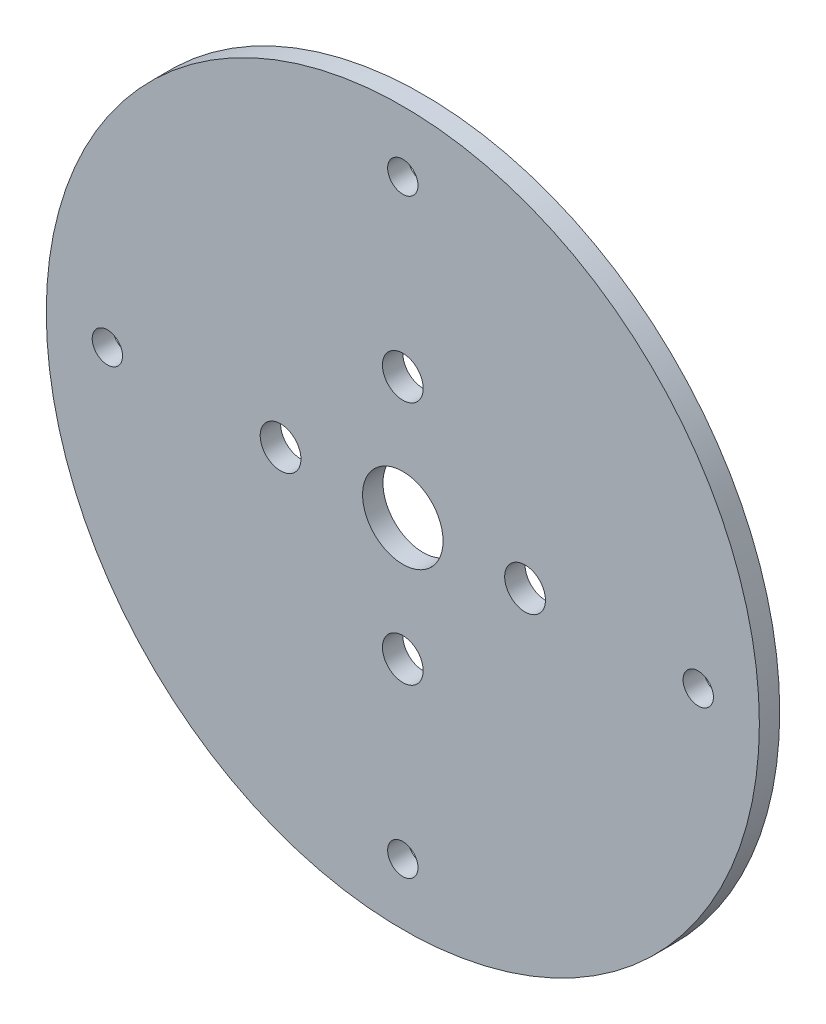
ISO-10303-21;
HEADER;
FILE_DESCRIPTION(('STEP AP214'),'2;1');
FILE_NAME('part.step','',(''),(''),'','','');
FILE_SCHEMA(('AUTOMOTIVE_DESIGN { 1 0 10303 214 1 1 1 1 }'));
ENDSEC;
DATA;
#1=APPLICATION_CONTEXT('core data for automotive mechanical design processes');
#2=APPLICATION_PROTOCOL_DEFINITION('international standard','automotive_design',2000,#1);
#3=PRODUCT_CONTEXT('',#1,'mechanical');
#4=PRODUCT('Part','Part','',(#3));
#5=PRODUCT_RELATED_PRODUCT_CATEGORY('part','',(#4));
#6=PRODUCT_DEFINITION_FORMATION('','',#4);
#7=PRODUCT_DEFINITION_CONTEXT('part definition',#1,'design');
#8=PRODUCT_DEFINITION('design','',#6,#7);
#9=PRODUCT_DEFINITION_SHAPE('','',#8);
#10=(LENGTH_UNIT() NAMED_UNIT(*) SI_UNIT(.MILLI.,.METRE.));
#11=(NAMED_UNIT(*) PLANE_ANGLE_UNIT() SI_UNIT($,.RADIAN.));
#12=(NAMED_UNIT(*) SI_UNIT($,.STERADIAN.) SOLID_ANGLE_UNIT());
#13=UNCERTAINTY_MEASURE_WITH_UNIT(LENGTH_MEASURE(1.E-05),#10,'distance_accuracy_value','');
#14=(GEOMETRIC_REPRESENTATION_CONTEXT(3) GLOBAL_UNCERTAINTY_ASSIGNED_CONTEXT((#13)) GLOBAL_UNIT_ASSIGNED_CONTEXT((#10,
#11,#12)) REPRESENTATION_CONTEXT('',''));
#15=CARTESIAN_POINT('',(0.,0.,0.));
#16=DIRECTION('',(0.,0.,1.));
#17=DIRECTION('',(1.,0.,0.));
#18=AXIS2_PLACEMENT_3D('',#15,#16,#17);
#19=CARTESIAN_POINT('',(0.,0.,2.));
#20=DIRECTION('',(0.,0.,1.));
#21=DIRECTION('',(1.,0.,0.));
#22=AXIS2_PLACEMENT_3D('',#19,#20,#21);
#23=PLANE('',#22);
#24=CARTESIAN_POINT('',(0.,-12.,2.));
#25=DIRECTION('',(0.,0.,1.));
#26=DIRECTION('',(1.,0.,0.));
#27=AXIS2_PLACEMENT_3D('',#24,#25,#26);
#28=CIRCLE('',#27,2.);
#29=CARTESIAN_POINT('',(2.,-12.,2.));
#30=VERTEX_POINT('',#29);
#31=EDGE_CURVE('E83',#30,#30,#28,.T.);
#32=ORIENTED_EDGE('',*,*,#31,.F.);
#33=EDGE_LOOP('',(#32));
#34=FACE_BOUND('',#33,.T.);
#35=CARTESIAN_POINT('',(0.,12.,2.));
#36=DIRECTION('',(0.,0.,1.));
#37=DIRECTION('',(1.,0.,0.));
#38=AXIS2_PLACEMENT_3D('',#35,#36,#37);
#39=CIRCLE('',#38,2.);
#40=CARTESIAN_POINT('',(2.,12.,2.));
#41=VERTEX_POINT('',#40);
#42=EDGE_CURVE('E71',#41,#41,#39,.T.);
#43=ORIENTED_EDGE('',*,*,#42,.F.);
#44=EDGE_LOOP('',(#43));
#45=FACE_BOUND('',#44,.T.);
#46=CARTESIAN_POINT('',(0.,29.,2.));
#47=DIRECTION('',(0.,0.,1.));
#48=DIRECTION('',(1.,0.,0.));
#49=AXIS2_PLACEMENT_3D('',#46,#47,#48);
#50=CIRCLE('',#49,1.49);
#51=CARTESIAN_POINT('',(1.49,29.,2.));
#52=VERTEX_POINT('',#51);
#53=EDGE_CURVE('E59',#52,#52,#50,.T.);
#54=ORIENTED_EDGE('',*,*,#53,.F.);
#55=EDGE_LOOP('',(#54));
#56=FACE_BOUND('',#55,.T.);
#57=CARTESIAN_POINT('',(0.,0.,2.));
#58=DIRECTION('',(0.,0.,1.));
#59=DIRECTION('',(1.,0.,0.));
#60=AXIS2_PLACEMENT_3D('',#57,#58,#59);
#61=CIRCLE('',#60,3.95);
#62=CARTESIAN_POINT('',(3.95,0.,2.));
#63=VERTEX_POINT('',#62);
#64=EDGE_CURVE('E47',#63,#63,#61,.T.);
#65=ORIENTED_EDGE('',*,*,#64,.F.);
#66=EDGE_LOOP('',(#65));
#67=FACE_BOUND('',#66,.T.);
#68=CARTESIAN_POINT('',(0.,0.,2.));
#69=DIRECTION('',(0.,0.,1.));
#70=DIRECTION('',(1.,0.,0.));
#71=AXIS2_PLACEMENT_3D('',#68,#69,#70);
#72=CIRCLE('',#71,35.);
#73=CARTESIAN_POINT('',(35.,0.,2.));
#74=VERTEX_POINT('',#73);
#75=EDGE_CURVE('E10',#74,#74,#72,.T.);
#76=ORIENTED_EDGE('',*,*,#75,.T.);
#77=EDGE_LOOP('',(#76));
#78=FACE_BOUND('',#77,.T.);
#79=CARTESIAN_POINT('',(-29.,0.,2.));
#80=DIRECTION('',(0.,0.,1.));
#81=DIRECTION('',(1.,0.,0.));
#82=AXIS2_PLACEMENT_3D('',#79,#80,#81);
#83=CIRCLE('',#82,1.49);
#84=CARTESIAN_POINT('',(-27.51,0.,2.));
#85=VERTEX_POINT('',#84);
#86=EDGE_CURVE('E42',#85,#85,#83,.T.);
#87=ORIENTED_EDGE('',*,*,#86,.F.);
#88=EDGE_LOOP('',(#87));
#89=FACE_BOUND('',#88,.T.);
#90=CARTESIAN_POINT('',(29.,0.,2.));
#91=DIRECTION('',(0.,0.,1.));
#92=DIRECTION('',(1.,0.,0.));
#93=AXIS2_PLACEMENT_3D('',#90,#91,#92);
#94=CIRCLE('',#93,1.49);
#95=CARTESIAN_POINT('',(30.49,0.,2.));
#96=VERTEX_POINT('',#95);
#97=EDGE_CURVE('E53',#96,#96,#94,.T.);
#98=ORIENTED_EDGE('',*,*,#97,.F.);
#99=EDGE_LOOP('',(#98));
#100=FACE_BOUND('',#99,.T.);
#101=CARTESIAN_POINT('',(0.,-29.,2.));
#102=DIRECTION('',(0.,0.,1.));
#103=DIRECTION('',(1.,0.,0.));
#104=AXIS2_PLACEMENT_3D('',#101,#102,#103);
#105=CIRCLE('',#104,1.49);
#106=CARTESIAN_POINT('',(1.49,-29.,2.));
#107=VERTEX_POINT('',#106);
#108=EDGE_CURVE('E65',#107,#107,#105,.T.);
#109=ORIENTED_EDGE('',*,*,#108,.F.);
#110=EDGE_LOOP('',(#109));
#111=FACE_BOUND('',#110,.T.);
#112=CARTESIAN_POINT('',(12.,0.,2.));
#113=DIRECTION('',(0.,0.,1.));
#114=DIRECTION('',(1.,0.,0.));
#115=AXIS2_PLACEMENT_3D('',#112,#113,#114);
#116=CIRCLE('',#115,2.);
#117=CARTESIAN_POINT('',(14.,0.,2.));
#118=VERTEX_POINT('',#117);
#119=EDGE_CURVE('E77',#118,#118,#116,.T.);
#120=ORIENTED_EDGE('',*,*,#119,.F.);
#121=EDGE_LOOP('',(#120));
#122=FACE_BOUND('',#121,.T.);
#123=CARTESIAN_POINT('',(-12.,0.,2.));
#124=DIRECTION('',(0.,0.,1.));
#125=DIRECTION('',(1.,0.,0.));
#126=AXIS2_PLACEMENT_3D('',#123,#124,#125);
#127=CIRCLE('',#126,2.);
#128=CARTESIAN_POINT('',(-10.,0.,2.));
#129=VERTEX_POINT('',#128);
#130=EDGE_CURVE('E89',#129,#129,#127,.T.);
#131=ORIENTED_EDGE('',*,*,#130,.F.);
#132=EDGE_LOOP('',(#131));
#133=FACE_BOUND('',#132,.T.);
#134=ADVANCED_FACE('F31',(#34,#45,#56,#67,#78,#89,#100,#111,#122,#133),#23,.T.);
#135=CARTESIAN_POINT('',(0.,0.,0.));
#136=DIRECTION('',(0.,0.,1.));
#137=DIRECTION('',(1.,0.,0.));
#138=AXIS2_PLACEMENT_3D('',#135,#136,#137);
#139=PLANE('',#138);
#140=CARTESIAN_POINT('',(0.,0.,0.));
#141=DIRECTION('',(0.,0.,1.));
#142=DIRECTION('',(1.,0.,0.));
#143=AXIS2_PLACEMENT_3D('',#140,#141,#142);
#144=CIRCLE('',#143,35.);
#145=CARTESIAN_POINT('',(35.,0.,0.));
#146=VERTEX_POINT('',#145);
#147=EDGE_CURVE('E35',#146,#146,#144,.T.);
#148=ORIENTED_EDGE('',*,*,#147,.F.);
#149=EDGE_LOOP('',(#148));
#150=FACE_BOUND('',#149,.T.);
#151=CARTESIAN_POINT('',(-29.,0.,0.));
#152=DIRECTION('',(0.,0.,1.));
#153=DIRECTION('',(1.,0.,0.));
#154=AXIS2_PLACEMENT_3D('',#151,#152,#153);
#155=CIRCLE('',#154,1.49);
#156=CARTESIAN_POINT('',(-27.51,0.,0.));
#157=VERTEX_POINT('',#156);
#158=EDGE_CURVE('E44',#157,#157,#155,.T.);
#159=ORIENTED_EDGE('',*,*,#158,.T.);
#160=EDGE_LOOP('',(#159));
#161=FACE_BOUND('',#160,.T.);
#162=CARTESIAN_POINT('',(0.,0.,0.));
#163=DIRECTION('',(0.,0.,1.));
#164=DIRECTION('',(1.,0.,0.));
#165=AXIS2_PLACEMENT_3D('',#162,#163,#164);
#166=CIRCLE('',#165,3.95);
#167=CARTESIAN_POINT('',(3.95,0.,0.));
#168=VERTEX_POINT('',#167);
#169=EDGE_CURVE('E50',#168,#168,#166,.T.);
#170=ORIENTED_EDGE('',*,*,#169,.T.);
#171=EDGE_LOOP('',(#170));
#172=FACE_BOUND('',#171,.T.);
#173=CARTESIAN_POINT('',(29.,0.,0.));
#174=DIRECTION('',(0.,0.,1.));
#175=DIRECTION('',(1.,0.,0.));
#176=AXIS2_PLACEMENT_3D('',#173,#174,#175);
#177=CIRCLE('',#176,1.49);
#178=CARTESIAN_POINT('',(30.49,0.,0.));
#179=VERTEX_POINT('',#178);
#180=EDGE_CURVE('E56',#179,#179,#177,.T.);
#181=ORIENTED_EDGE('',*,*,#180,.T.);
#182=EDGE_LOOP('',(#181));
#183=FACE_BOUND('',#182,.T.);
#184=CARTESIAN_POINT('',(0.,29.,0.));
#185=DIRECTION('',(0.,0.,1.));
#186=DIRECTION('',(1.,0.,0.));
#187=AXIS2_PLACEMENT_3D('',#184,#185,#186);
#188=CIRCLE('',#187,1.49);
#189=CARTESIAN_POINT('',(1.49,29.,0.));
#190=VERTEX_POINT('',#189);
#191=EDGE_CURVE('E62',#190,#190,#188,.T.);
#192=ORIENTED_EDGE('',*,*,#191,.T.);
#193=EDGE_LOOP('',(#192));
#194=FACE_BOUND('',#193,.T.);
#195=CARTESIAN_POINT('',(0.,-29.,0.));
#196=DIRECTION('',(0.,0.,1.));
#197=DIRECTION('',(1.,0.,0.));
#198=AXIS2_PLACEMENT_3D('',#195,#196,#197);
#199=CIRCLE('',#198,1.49);
#200=CARTESIAN_POINT('',(1.49,-29.,0.));
#201=VERTEX_POINT('',#200);
#202=EDGE_CURVE('E68',#201,#201,#199,.T.);
#203=ORIENTED_EDGE('',*,*,#202,.T.);
#204=EDGE_LOOP('',(#203));
#205=FACE_BOUND('',#204,.T.);
#206=CARTESIAN_POINT('',(0.,12.,0.));
#207=DIRECTION('',(0.,0.,1.));
#208=DIRECTION('',(1.,0.,0.));
#209=AXIS2_PLACEMENT_3D('',#206,#207,#208);
#210=CIRCLE('',#209,2.);
#211=CARTESIAN_POINT('',(2.,12.,0.));
#212=VERTEX_POINT('',#211);
#213=EDGE_CURVE('E74',#212,#212,#210,.T.);
#214=ORIENTED_EDGE('',*,*,#213,.T.);
#215=EDGE_LOOP('',(#214));
#216=FACE_BOUND('',#215,.T.);
#217=CARTESIAN_POINT('',(12.,0.,0.));
#218=DIRECTION('',(0.,0.,1.));
#219=DIRECTION('',(1.,0.,0.));
#220=AXIS2_PLACEMENT_3D('',#217,#218,#219);
#221=CIRCLE('',#220,2.);
#222=CARTESIAN_POINT('',(14.,0.,0.));
#223=VERTEX_POINT('',#222);
#224=EDGE_CURVE('E80',#223,#223,#221,.T.);
#225=ORIENTED_EDGE('',*,*,#224,.T.);
#226=EDGE_LOOP('',(#225));
#227=FACE_BOUND('',#226,.T.);
#228=CARTESIAN_POINT('',(0.,-12.,0.));
#229=DIRECTION('',(0.,0.,1.));
#230=DIRECTION('',(1.,0.,0.));
#231=AXIS2_PLACEMENT_3D('',#228,#229,#230);
#232=CIRCLE('',#231,2.);
#233=CARTESIAN_POINT('',(2.,-12.,0.));
#234=VERTEX_POINT('',#233);
#235=EDGE_CURVE('E86',#234,#234,#232,.T.);
#236=ORIENTED_EDGE('',*,*,#235,.T.);
#237=EDGE_LOOP('',(#236));
#238=FACE_BOUND('',#237,.T.);
#239=CARTESIAN_POINT('',(-12.,0.,0.));
#240=DIRECTION('',(0.,0.,1.));
#241=DIRECTION('',(1.,0.,0.));
#242=AXIS2_PLACEMENT_3D('',#239,#240,#241);
#243=CIRCLE('',#242,2.);
#244=CARTESIAN_POINT('',(-10.,0.,0.));
#245=VERTEX_POINT('',#244);
#246=EDGE_CURVE('E92',#245,#245,#243,.T.);
#247=ORIENTED_EDGE('',*,*,#246,.T.);
#248=EDGE_LOOP('',(#247));
#249=FACE_BOUND('',#248,.T.);
#250=ADVANCED_FACE('F102',(#150,#161,#172,#183,#194,#205,#216,#227,#238,#249),#139,.F.);
#251=CARTESIAN_POINT('',(0.,0.,2.));
#252=DIRECTION('',(0.,0.,-1.));
#253=DIRECTION('',(-1.,0.,0.));
#254=AXIS2_PLACEMENT_3D('',#251,#252,#253);
#255=CYLINDRICAL_SURFACE('',#254,35.);
#256=ORIENTED_EDGE('',*,*,#75,.F.);
#257=EDGE_LOOP('',(#256));
#258=FACE_BOUND('',#257,.T.);
#259=ORIENTED_EDGE('',*,*,#147,.T.);
#260=EDGE_LOOP('',(#259));
#261=FACE_BOUND('',#260,.T.);
#262=ADVANCED_FACE('F33',(#258,#261),#255,.T.);
#263=CARTESIAN_POINT('',(-29.,0.,2.));
#264=DIRECTION('',(0.,0.,-1.));
#265=DIRECTION('',(-1.,0.,0.));
#266=AXIS2_PLACEMENT_3D('',#263,#264,#265);
#267=CYLINDRICAL_SURFACE('',#266,1.49);
#268=ORIENTED_EDGE('',*,*,#86,.T.);
#269=EDGE_LOOP('',(#268));
#270=FACE_BOUND('',#269,.T.);
#271=ORIENTED_EDGE('',*,*,#158,.F.);
#272=EDGE_LOOP('',(#271));
#273=FACE_BOUND('',#272,.T.);
#274=ADVANCED_FACE('F112',(#270,#273),#267,.F.);
#275=CARTESIAN_POINT('',(0.,0.,2.));
#276=DIRECTION('',(0.,0.,-1.));
#277=DIRECTION('',(-1.,0.,0.));
#278=AXIS2_PLACEMENT_3D('',#275,#276,#277);
#279=CYLINDRICAL_SURFACE('',#278,3.95);
#280=ORIENTED_EDGE('',*,*,#64,.T.);
#281=EDGE_LOOP('',(#280));
#282=FACE_BOUND('',#281,.T.);
#283=ORIENTED_EDGE('',*,*,#169,.F.);
#284=EDGE_LOOP('',(#283));
#285=FACE_BOUND('',#284,.T.);
#286=ADVANCED_FACE('F115',(#282,#285),#279,.F.);
#287=CARTESIAN_POINT('',(29.,0.,2.));
#288=DIRECTION('',(0.,0.,-1.));
#289=DIRECTION('',(-1.,0.,0.));
#290=AXIS2_PLACEMENT_3D('',#287,#288,#289);
#291=CYLINDRICAL_SURFACE('',#290,1.49);
#292=ORIENTED_EDGE('',*,*,#97,.T.);
#293=EDGE_LOOP('',(#292));
#294=FACE_BOUND('',#293,.T.);
#295=ORIENTED_EDGE('',*,*,#180,.F.);
#296=EDGE_LOOP('',(#295));
#297=FACE_BOUND('',#296,.T.);
#298=ADVANCED_FACE('F119',(#294,#297),#291,.F.);
#299=CARTESIAN_POINT('',(0.,29.,2.));
#300=DIRECTION('',(0.,0.,-1.));
#301=DIRECTION('',(-1.,0.,0.));
#302=AXIS2_PLACEMENT_3D('',#299,#300,#301);
#303=CYLINDRICAL_SURFACE('',#302,1.49);
#304=ORIENTED_EDGE('',*,*,#53,.T.);
#305=EDGE_LOOP('',(#304));
#306=FACE_BOUND('',#305,.T.);
#307=ORIENTED_EDGE('',*,*,#191,.F.);
#308=EDGE_LOOP('',(#307));
#309=FACE_BOUND('',#308,.T.);
#310=ADVANCED_FACE('F123',(#306,#309),#303,.F.);
#311=CARTESIAN_POINT('',(0.,-29.,2.));
#312=DIRECTION('',(0.,0.,-1.));
#313=DIRECTION('',(-1.,0.,0.));
#314=AXIS2_PLACEMENT_3D('',#311,#312,#313);
#315=CYLINDRICAL_SURFACE('',#314,1.49);
#316=ORIENTED_EDGE('',*,*,#108,.T.);
#317=EDGE_LOOP('',(#316));
#318=FACE_BOUND('',#317,.T.);
#319=ORIENTED_EDGE('',*,*,#202,.F.);
#320=EDGE_LOOP('',(#319));
#321=FACE_BOUND('',#320,.T.);
#322=ADVANCED_FACE('F127',(#318,#321),#315,.F.);
#323=CARTESIAN_POINT('',(0.,12.,2.));
#324=DIRECTION('',(0.,0.,-1.));
#325=DIRECTION('',(-1.,0.,0.));
#326=AXIS2_PLACEMENT_3D('',#323,#324,#325);
#327=CYLINDRICAL_SURFACE('',#326,2.);
#328=ORIENTED_EDGE('',*,*,#42,.T.);
#329=EDGE_LOOP('',(#328));
#330=FACE_BOUND('',#329,.T.);
#331=ORIENTED_EDGE('',*,*,#213,.F.);
#332=EDGE_LOOP('',(#331));
#333=FACE_BOUND('',#332,.T.);
#334=ADVANCED_FACE('F131',(#330,#333),#327,.F.);
#335=CARTESIAN_POINT('',(12.,0.,2.));
#336=DIRECTION('',(0.,0.,-1.));
#337=DIRECTION('',(-1.,0.,0.));
#338=AXIS2_PLACEMENT_3D('',#335,#336,#337);
#339=CYLINDRICAL_SURFACE('',#338,2.);
#340=ORIENTED_EDGE('',*,*,#119,.T.);
#341=EDGE_LOOP('',(#340));
#342=FACE_BOUND('',#341,.T.);
#343=ORIENTED_EDGE('',*,*,#224,.F.);
#344=EDGE_LOOP('',(#343));
#345=FACE_BOUND('',#344,.T.);
#346=ADVANCED_FACE('F135',(#342,#345),#339,.F.);
#347=CARTESIAN_POINT('',(0.,-12.,2.));
#348=DIRECTION('',(0.,0.,-1.));
#349=DIRECTION('',(-1.,0.,0.));
#350=AXIS2_PLACEMENT_3D('',#347,#348,#349);
#351=CYLINDRICAL_SURFACE('',#350,2.);
#352=ORIENTED_EDGE('',*,*,#31,.T.);
#353=EDGE_LOOP('',(#352));
#354=FACE_BOUND('',#353,.T.);
#355=ORIENTED_EDGE('',*,*,#235,.F.);
#356=EDGE_LOOP('',(#355));
#357=FACE_BOUND('',#356,.T.);
#358=ADVANCED_FACE('F139',(#354,#357),#351,.F.);
#359=CARTESIAN_POINT('',(-12.,0.,2.));
#360=DIRECTION('',(0.,0.,-1.));
#361=DIRECTION('',(-1.,0.,0.));
#362=AXIS2_PLACEMENT_3D('',#359,#360,#361);
#363=CYLINDRICAL_SURFACE('',#362,2.);
#364=ORIENTED_EDGE('',*,*,#130,.T.);
#365=EDGE_LOOP('',(#364));
#366=FACE_BOUND('',#365,.T.);
#367=ORIENTED_EDGE('',*,*,#246,.F.);
#368=EDGE_LOOP('',(#367));
#369=FACE_BOUND('',#368,.T.);
#370=ADVANCED_FACE('F98',(#366,#369),#363,.F.);
#371=CLOSED_SHELL('',(#134,#250,#262,#274,#286,#298,#310,#322,#334,#346,#358,#370));
#372=MANIFOLD_SOLID_BREP('B2',#371);
#373=ADVANCED_BREP_SHAPE_REPRESENTATION('',(#18,#372),#14);
#374=SHAPE_DEFINITION_REPRESENTATION(#9,#373);
ENDSEC;
END-ISO-10303-21;
